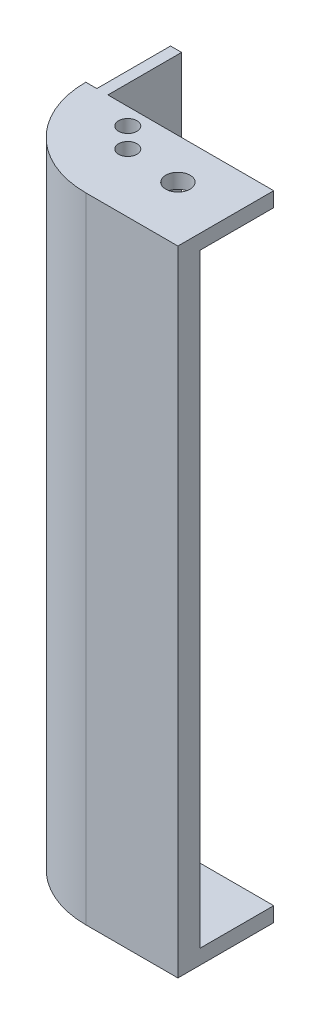
ISO-10303-21;
HEADER;
FILE_DESCRIPTION(('STEP AP214'),'2;1');
FILE_NAME('part.step','',(''),(''),'','','');
FILE_SCHEMA(('AUTOMOTIVE_DESIGN { 1 0 10303 214 1 1 1 1 }'));
ENDSEC;
DATA;
#1=APPLICATION_CONTEXT('core data for automotive mechanical design processes');
#2=APPLICATION_PROTOCOL_DEFINITION('international standard','automotive_design',2000,#1);
#3=PRODUCT_CONTEXT('',#1,'mechanical');
#4=PRODUCT('Part','Part','',(#3));
#5=PRODUCT_RELATED_PRODUCT_CATEGORY('part','',(#4));
#6=PRODUCT_DEFINITION_FORMATION('','',#4);
#7=PRODUCT_DEFINITION_CONTEXT('part definition',#1,'design');
#8=PRODUCT_DEFINITION('design','',#6,#7);
#9=PRODUCT_DEFINITION_SHAPE('','',#8);
#10=(LENGTH_UNIT() NAMED_UNIT(*) SI_UNIT(.MILLI.,.METRE.));
#11=(NAMED_UNIT(*) PLANE_ANGLE_UNIT() SI_UNIT($,.RADIAN.));
#12=(NAMED_UNIT(*) SI_UNIT($,.STERADIAN.) SOLID_ANGLE_UNIT());
#13=UNCERTAINTY_MEASURE_WITH_UNIT(LENGTH_MEASURE(1.E-05),#10,'distance_accuracy_value','');
#14=(GEOMETRIC_REPRESENTATION_CONTEXT(3) GLOBAL_UNCERTAINTY_ASSIGNED_CONTEXT((#13)) GLOBAL_UNIT_ASSIGNED_CONTEXT((#10,
#11,#12)) REPRESENTATION_CONTEXT('',''));
#15=CARTESIAN_POINT('',(0.,0.,0.));
#16=DIRECTION('',(0.,0.,1.));
#17=DIRECTION('',(1.,0.,0.));
#18=AXIS2_PLACEMENT_3D('',#15,#16,#17);
#19=CARTESIAN_POINT('',(0.,86.,2.49999999999996));
#20=DIRECTION('',(0.,0.,1.));
#21=DIRECTION('',(1.,0.,0.));
#22=AXIS2_PLACEMENT_3D('',#19,#20,#21);
#23=PLANE('',#22);
#24=DIRECTION('',(0.,1.,0.));
#25=VECTOR('',#24,1.);
#26=CARTESIAN_POINT('',(0.,86.,2.49999999999996));
#27=LINE('',#26,#25);
#28=CARTESIAN_POINT('',(0.,2.,2.5));
#29=VERTEX_POINT('',#28);
#30=CARTESIAN_POINT('',(0.,84.,2.49999999999996));
#31=VERTEX_POINT('',#30);
#32=EDGE_CURVE('E201',#29,#31,#27,.T.);
#33=ORIENTED_EDGE('',*,*,#32,.F.);
#34=DIRECTION('',(-1.,0.,0.));
#35=VECTOR('',#34,1.);
#36=CARTESIAN_POINT('',(10.1980390271856,2.,2.49999999999991));
#37=LINE('',#36,#35);
#38=CARTESIAN_POINT('',(-12.5,2.,2.5));
#39=VERTEX_POINT('',#38);
#40=EDGE_CURVE('E181',#29,#39,#37,.T.);
#41=ORIENTED_EDGE('',*,*,#40,.T.);
#42=DIRECTION('',(0.,1.,0.));
#43=VECTOR('',#42,1.);
#44=CARTESIAN_POINT('',(-12.5,2.,2.5));
#45=LINE('',#44,#43);
#46=CARTESIAN_POINT('',(-12.5,84.,2.5));
#47=VERTEX_POINT('',#46);
#48=EDGE_CURVE('E12',#39,#47,#45,.T.);
#49=ORIENTED_EDGE('',*,*,#48,.T.);
#50=DIRECTION('',(-1.,0.,0.));
#51=VECTOR('',#50,1.);
#52=CARTESIAN_POINT('',(10.1980390271856,84.,2.49999999999991));
#53=LINE('',#52,#51);
#54=EDGE_CURVE('E92',#31,#47,#53,.T.);
#55=ORIENTED_EDGE('',*,*,#54,.F.);
#56=EDGE_LOOP('',(#33,#41,#49,#55));
#57=FACE_BOUND('',#56,.T.);
#58=ADVANCED_FACE('F77',(#57),#23,.F.);
#59=CARTESIAN_POINT('',(-12.5,104.38477631085,-7.5));
#60=DIRECTION('',(0.,-1.,0.));
#61=DIRECTION('',(0.,0.,-1.));
#62=AXIS2_PLACEMENT_3D('',#59,#60,#61);
#63=CYLINDRICAL_SURFACE('',#62,10.);
#64=CARTESIAN_POINT('',(-12.5,2.,-7.5));
#65=DIRECTION('',(0.,1.,0.));
#66=DIRECTION('',(0.,0.,1.));
#67=AXIS2_PLACEMENT_3D('',#64,#65,#66);
#68=CIRCLE('',#67,10.);
#69=CARTESIAN_POINT('',(-22.5,2.,-7.5));
#70=VERTEX_POINT('',#69);
#71=EDGE_CURVE('E100',#70,#39,#68,.T.);
#72=ORIENTED_EDGE('',*,*,#71,.F.);
#73=DIRECTION('',(0.,-1.,0.));
#74=VECTOR('',#73,1.);
#75=CARTESIAN_POINT('',(-22.5,104.38477631085,-7.5));
#76=LINE('',#75,#74);
#77=CARTESIAN_POINT('',(-22.5,84.,-7.5));
#78=VERTEX_POINT('',#77);
#79=EDGE_CURVE('E286',#78,#70,#76,.T.);
#80=ORIENTED_EDGE('',*,*,#79,.F.);
#81=CARTESIAN_POINT('',(-12.5,84.,-7.5));
#82=DIRECTION('',(0.,1.,0.));
#83=DIRECTION('',(0.,0.,1.));
#84=AXIS2_PLACEMENT_3D('',#81,#82,#83);
#85=CIRCLE('',#84,10.);
#86=EDGE_CURVE('E243',#78,#47,#85,.T.);
#87=ORIENTED_EDGE('',*,*,#86,.T.);
#88=ORIENTED_EDGE('',*,*,#48,.F.);
#89=EDGE_LOOP('',(#72,#80,#87,#88));
#90=FACE_BOUND('',#89,.T.);
#91=ADVANCED_FACE('F340',(#90),#63,.F.);
#92=CARTESIAN_POINT('',(0.,0.,0.));
#93=DIRECTION('',(0.,1.,0.));
#94=DIRECTION('',(0.,0.,1.));
#95=AXIS2_PLACEMENT_3D('',#92,#93,#94);
#96=PLANE('',#95);
#97=CARTESIAN_POINT('',(-7.50000000000003,0.,-2.00000000000005));
#98=DIRECTION('',(0.,1.,0.));
#99=DIRECTION('',(0.,0.,1.));
#100=AXIS2_PLACEMENT_3D('',#97,#98,#99);
#101=CIRCLE('',#100,1.65);
#102=CARTESIAN_POINT('',(-7.50000000000003,0.,-0.35000000000005));
#103=VERTEX_POINT('',#102);
#104=EDGE_CURVE('E191',#103,#103,#101,.T.);
#105=ORIENTED_EDGE('',*,*,#104,.T.);
#106=EDGE_LOOP('',(#105));
#107=FACE_BOUND('',#106,.T.);
#108=DIRECTION('',(-1.,0.,0.));
#109=VECTOR('',#108,1.);
#110=CARTESIAN_POINT('',(-12.5,0.,-7.5));
#111=LINE('',#110,#109);
#112=CARTESIAN_POINT('',(0.,0.,-7.50000000000005));
#113=VERTEX_POINT('',#112);
#114=CARTESIAN_POINT('',(-22.5,0.,-7.5));
#115=VERTEX_POINT('',#114);
#116=EDGE_CURVE('E228',#113,#115,#111,.T.);
#117=ORIENTED_EDGE('',*,*,#116,.F.);
#118=DIRECTION('',(0.,0.,-1.));
#119=VECTOR('',#118,1.);
#120=CARTESIAN_POINT('',(0.,0.,5.49999999999995));
#121=LINE('',#120,#119);
#122=CARTESIAN_POINT('',(0.,0.,5.49999999999995));
#123=VERTEX_POINT('',#122);
#124=EDGE_CURVE('E190',#123,#113,#121,.T.);
#125=ORIENTED_EDGE('',*,*,#124,.F.);
#126=DIRECTION('',(-1.,0.,0.));
#127=VECTOR('',#126,1.);
#128=CARTESIAN_POINT('',(0.,0.,5.49999999999995));
#129=LINE('',#128,#127);
#130=CARTESIAN_POINT('',(-12.5,0.,5.5));
#131=VERTEX_POINT('',#130);
#132=EDGE_CURVE('E214',#123,#131,#129,.T.);
#133=ORIENTED_EDGE('',*,*,#132,.T.);
#134=CARTESIAN_POINT('',(-12.5,0.,-7.5));
#135=DIRECTION('',(0.,1.,0.));
#136=DIRECTION('',(0.,0.,1.));
#137=AXIS2_PLACEMENT_3D('',#134,#135,#136);
#138=CIRCLE('',#137,13.);
#139=CARTESIAN_POINT('',(-25.5,0.,-7.5));
#140=VERTEX_POINT('',#139);
#141=EDGE_CURVE('E273',#131,#140,#138,.F.);
#142=ORIENTED_EDGE('',*,*,#141,.T.);
#143=DIRECTION('',(1.,0.,0.));
#144=VECTOR('',#143,1.);
#145=CARTESIAN_POINT('',(-22.5,0.,-7.5));
#146=LINE('',#145,#144);
#147=CARTESIAN_POINT('',(-24.,0.,-7.5));
#148=VERTEX_POINT('',#147);
#149=EDGE_CURVE('E280',#140,#148,#146,.T.);
#150=ORIENTED_EDGE('',*,*,#149,.T.);
#151=DIRECTION('',(0.,0.,1.));
#152=VECTOR('',#151,1.);
#153=CARTESIAN_POINT('',(-24.,0.,-17.5));
#154=LINE('',#153,#152);
#155=CARTESIAN_POINT('',(-24.,0.,-17.5));
#156=VERTEX_POINT('',#155);
#157=EDGE_CURVE('E266',#156,#148,#154,.T.);
#158=ORIENTED_EDGE('',*,*,#157,.F.);
#159=DIRECTION('',(-1.,0.,0.));
#160=VECTOR('',#159,1.);
#161=CARTESIAN_POINT('',(-22.5,0.,-17.5));
#162=LINE('',#161,#160);
#163=CARTESIAN_POINT('',(-22.5,0.,-17.5));
#164=VERTEX_POINT('',#163);
#165=EDGE_CURVE('E253',#164,#156,#162,.T.);
#166=ORIENTED_EDGE('',*,*,#165,.F.);
#167=DIRECTION('',(0.,0.,1.));
#168=VECTOR('',#167,1.);
#169=CARTESIAN_POINT('',(-22.5,0.,-17.5));
#170=LINE('',#169,#168);
#171=EDGE_CURVE('E275',#164,#115,#170,.T.);
#172=ORIENTED_EDGE('',*,*,#171,.T.);
#173=EDGE_LOOP('',(#117,#125,#133,#142,#150,#158,#166,#172));
#174=FACE_BOUND('',#173,.T.);
#175=CARTESIAN_POINT('',(-14.8,0.,-2.5));
#176=DIRECTION('',(0.,1.,0.));
#177=DIRECTION('',(0.,0.,1.));
#178=AXIS2_PLACEMENT_3D('',#175,#176,#177);
#179=CIRCLE('',#178,1.25);
#180=CARTESIAN_POINT('',(-14.8,0.,-1.25));
#181=VERTEX_POINT('',#180);
#182=EDGE_CURVE('E224',#181,#181,#179,.F.);
#183=ORIENTED_EDGE('',*,*,#182,.F.);
#184=EDGE_LOOP('',(#183));
#185=FACE_BOUND('',#184,.T.);
#186=CARTESIAN_POINT('',(-17.5,0.,-5.2));
#187=DIRECTION('',(0.,1.,0.));
#188=DIRECTION('',(0.,0.,1.));
#189=AXIS2_PLACEMENT_3D('',#186,#187,#188);
#190=CIRCLE('',#189,1.25);
#191=CARTESIAN_POINT('',(-17.5,0.,-3.95));
#192=VERTEX_POINT('',#191);
#193=EDGE_CURVE('E220',#192,#192,#190,.F.);
#194=ORIENTED_EDGE('',*,*,#193,.F.);
#195=EDGE_LOOP('',(#194));
#196=FACE_BOUND('',#195,.T.);
#197=ADVANCED_FACE('F76',(#107,#174,#185,#196),#96,.F.);
#198=CARTESIAN_POINT('',(0.,86.,0.));
#199=DIRECTION('',(0.,-1.,0.));
#200=DIRECTION('',(0.,0.,-1.));
#201=AXIS2_PLACEMENT_3D('',#198,#199,#200);
#202=PLANE('',#201);
#203=CARTESIAN_POINT('',(-7.50000000000003,86.,-2.00000000000005));
#204=DIRECTION('',(0.,1.,0.));
#205=DIRECTION('',(0.,0.,1.));
#206=AXIS2_PLACEMENT_3D('',#203,#204,#205);
#207=CIRCLE('',#206,1.65);
#208=CARTESIAN_POINT('',(-7.50000000000003,86.,-0.35000000000005));
#209=VERTEX_POINT('',#208);
#210=EDGE_CURVE('E561',#209,#209,#207,.T.);
#211=ORIENTED_EDGE('',*,*,#210,.F.);
#212=EDGE_LOOP('',(#211));
#213=FACE_BOUND('',#212,.T.);
#214=CARTESIAN_POINT('',(-14.8,86.,-2.5));
#215=DIRECTION('',(0.,-1.,0.));
#216=DIRECTION('',(0.,0.,-1.));
#217=AXIS2_PLACEMENT_3D('',#214,#215,#216);
#218=CIRCLE('',#217,1.25);
#219=CARTESIAN_POINT('',(-14.8,86.,-3.75));
#220=VERTEX_POINT('',#219);
#221=EDGE_CURVE('E237',#220,#220,#218,.T.);
#222=ORIENTED_EDGE('',*,*,#221,.T.);
#223=EDGE_LOOP('',(#222));
#224=FACE_BOUND('',#223,.T.);
#225=CARTESIAN_POINT('',(-17.5,86.,-5.2));
#226=DIRECTION('',(0.,-1.,0.));
#227=DIRECTION('',(0.,0.,-1.));
#228=AXIS2_PLACEMENT_3D('',#225,#226,#227);
#229=CIRCLE('',#228,1.25);
#230=CARTESIAN_POINT('',(-17.5,86.,-6.45));
#231=VERTEX_POINT('',#230);
#232=EDGE_CURVE('E234',#231,#231,#229,.T.);
#233=ORIENTED_EDGE('',*,*,#232,.T.);
#234=EDGE_LOOP('',(#233));
#235=FACE_BOUND('',#234,.T.);
#236=CARTESIAN_POINT('',(-12.5,86.,-7.5));
#237=DIRECTION('',(0.,-1.,0.));
#238=DIRECTION('',(0.,0.,-1.));
#239=AXIS2_PLACEMENT_3D('',#236,#237,#238);
#240=CIRCLE('',#239,13.);
#241=CARTESIAN_POINT('',(-12.5,86.,5.5));
#242=VERTEX_POINT('',#241);
#243=CARTESIAN_POINT('',(-25.5,86.,-7.5));
#244=VERTEX_POINT('',#243);
#245=EDGE_CURVE('E284',#242,#244,#240,.T.);
#246=ORIENTED_EDGE('',*,*,#245,.F.);
#247=DIRECTION('',(-1.,0.,0.));
#248=VECTOR('',#247,1.);
#249=CARTESIAN_POINT('',(0.,86.,5.49999999999995));
#250=LINE('',#249,#248);
#251=CARTESIAN_POINT('',(0.,86.,5.49999999999995));
#252=VERTEX_POINT('',#251);
#253=EDGE_CURVE('E206',#252,#242,#250,.T.);
#254=ORIENTED_EDGE('',*,*,#253,.F.);
#255=DIRECTION('',(0.,0.,1.));
#256=VECTOR('',#255,1.);
#257=CARTESIAN_POINT('',(0.,86.,5.49999999999995));
#258=LINE('',#257,#256);
#259=CARTESIAN_POINT('',(0.,86.,-7.50000000000005));
#260=VERTEX_POINT('',#259);
#261=EDGE_CURVE('E207',#260,#252,#258,.T.);
#262=ORIENTED_EDGE('',*,*,#261,.F.);
#263=DIRECTION('',(-1.,0.,0.));
#264=VECTOR('',#263,1.);
#265=CARTESIAN_POINT('',(-12.5,86.,-7.5));
#266=LINE('',#265,#264);
#267=CARTESIAN_POINT('',(-22.5,86.,-7.5));
#268=VERTEX_POINT('',#267);
#269=EDGE_CURVE('E245',#260,#268,#266,.T.);
#270=ORIENTED_EDGE('',*,*,#269,.T.);
#271=DIRECTION('',(0.,0.,1.));
#272=VECTOR('',#271,1.);
#273=CARTESIAN_POINT('',(-22.5,86.,-17.5));
#274=LINE('',#273,#272);
#275=CARTESIAN_POINT('',(-22.5,86.,-17.5));
#276=VERTEX_POINT('',#275);
#277=EDGE_CURVE('E262',#276,#268,#274,.T.);
#278=ORIENTED_EDGE('',*,*,#277,.F.);
#279=DIRECTION('',(1.,0.,0.));
#280=VECTOR('',#279,1.);
#281=CARTESIAN_POINT('',(-22.5,86.,-17.5));
#282=LINE('',#281,#280);
#283=CARTESIAN_POINT('',(-24.,86.,-17.5));
#284=VERTEX_POINT('',#283);
#285=EDGE_CURVE('E258',#284,#276,#282,.T.);
#286=ORIENTED_EDGE('',*,*,#285,.F.);
#287=DIRECTION('',(0.,0.,1.));
#288=VECTOR('',#287,1.);
#289=CARTESIAN_POINT('',(-24.,86.,-17.5));
#290=LINE('',#289,#288);
#291=CARTESIAN_POINT('',(-24.,86.,-7.5));
#292=VERTEX_POINT('',#291);
#293=EDGE_CURVE('E267',#284,#292,#290,.T.);
#294=ORIENTED_EDGE('',*,*,#293,.T.);
#295=DIRECTION('',(1.,0.,0.));
#296=VECTOR('',#295,1.);
#297=CARTESIAN_POINT('',(-22.5,86.,-7.5));
#298=LINE('',#297,#296);
#299=EDGE_CURVE('E283',#244,#292,#298,.T.);
#300=ORIENTED_EDGE('',*,*,#299,.F.);
#301=EDGE_LOOP('',(#246,#254,#262,#270,#278,#286,#294,#300));
#302=FACE_BOUND('',#301,.T.);
#303=ADVANCED_FACE('F303',(#213,#224,#235,#302),#202,.F.);
#304=CARTESIAN_POINT('',(-22.5,104.38477631085,-7.5));
#305=DIRECTION('',(0.,0.,1.));
#306=DIRECTION('',(1.,0.,0.));
#307=AXIS2_PLACEMENT_3D('',#304,#305,#306);
#308=PLANE('',#307);
#309=DIRECTION('',(0.,1.,0.));
#310=VECTOR('',#309,1.);
#311=CARTESIAN_POINT('',(-24.,86.,-7.5));
#312=LINE('',#311,#310);
#313=EDGE_CURVE('E248',#148,#292,#312,.T.);
#314=ORIENTED_EDGE('',*,*,#313,.F.);
#315=ORIENTED_EDGE('',*,*,#149,.F.);
#316=DIRECTION('',(0.,-1.,0.));
#317=VECTOR('',#316,1.);
#318=CARTESIAN_POINT('',(-25.5,104.38477631085,-7.5));
#319=LINE('',#318,#317);
#320=EDGE_CURVE('E282',#244,#140,#319,.T.);
#321=ORIENTED_EDGE('',*,*,#320,.F.);
#322=ORIENTED_EDGE('',*,*,#299,.T.);
#323=EDGE_LOOP('',(#314,#315,#321,#322));
#324=FACE_BOUND('',#323,.T.);
#325=ADVANCED_FACE('F307',(#324),#308,.F.);
#326=CARTESIAN_POINT('',(-12.5,104.38477631085,-7.5));
#327=DIRECTION('',(0.,-1.,0.));
#328=DIRECTION('',(0.,0.,-1.));
#329=AXIS2_PLACEMENT_3D('',#326,#327,#328);
#330=CYLINDRICAL_SURFACE('',#329,13.);
#331=DIRECTION('',(0.,1.,0.));
#332=VECTOR('',#331,1.);
#333=CARTESIAN_POINT('',(-12.5,0.,5.5));
#334=LINE('',#333,#332);
#335=EDGE_CURVE('E82',#131,#242,#334,.T.);
#336=ORIENTED_EDGE('',*,*,#335,.T.);
#337=ORIENTED_EDGE('',*,*,#245,.T.);
#338=ORIENTED_EDGE('',*,*,#320,.T.);
#339=ORIENTED_EDGE('',*,*,#141,.F.);
#340=EDGE_LOOP('',(#336,#337,#338,#339));
#341=FACE_BOUND('',#340,.T.);
#342=ADVANCED_FACE('F294',(#341),#330,.T.);
#343=CARTESIAN_POINT('',(-22.5,86.,-17.5));
#344=DIRECTION('',(-1.,0.,0.));
#345=DIRECTION('',(0.,0.,1.));
#346=AXIS2_PLACEMENT_3D('',#343,#344,#345);
#347=PLANE('',#346);
#348=EDGE_CURVE('E287',#268,#78,#76,.T.);
#349=ORIENTED_EDGE('',*,*,#348,.T.);
#350=ORIENTED_EDGE('',*,*,#79,.T.);
#351=DIRECTION('',(0.,-1.,0.));
#352=VECTOR('',#351,1.);
#353=CARTESIAN_POINT('',(-22.5,2.,-7.5));
#354=LINE('',#353,#352);
#355=EDGE_CURVE('E174',#70,#115,#354,.T.);
#356=ORIENTED_EDGE('',*,*,#355,.T.);
#357=ORIENTED_EDGE('',*,*,#171,.F.);
#358=DIRECTION('',(0.,-1.,0.));
#359=VECTOR('',#358,1.);
#360=CARTESIAN_POINT('',(-22.5,86.,-17.5));
#361=LINE('',#360,#359);
#362=EDGE_CURVE('E255',#276,#164,#361,.T.);
#363=ORIENTED_EDGE('',*,*,#362,.F.);
#364=ORIENTED_EDGE('',*,*,#277,.T.);
#365=EDGE_LOOP('',(#349,#350,#356,#357,#363,#364));
#366=FACE_BOUND('',#365,.T.);
#367=ADVANCED_FACE('F318',(#366),#347,.F.);
#368=CARTESIAN_POINT('',(-24.,86.,-17.5));
#369=DIRECTION('',(1.,0.,0.));
#370=DIRECTION('',(0.,1.,0.));
#371=AXIS2_PLACEMENT_3D('',#368,#369,#370);
#372=PLANE('',#371);
#373=ORIENTED_EDGE('',*,*,#313,.T.);
#374=ORIENTED_EDGE('',*,*,#293,.F.);
#375=DIRECTION('',(0.,1.,0.));
#376=VECTOR('',#375,1.);
#377=CARTESIAN_POINT('',(-24.,86.,-17.5));
#378=LINE('',#377,#376);
#379=EDGE_CURVE('E256',#156,#284,#378,.T.);
#380=ORIENTED_EDGE('',*,*,#379,.F.);
#381=ORIENTED_EDGE('',*,*,#157,.T.);
#382=EDGE_LOOP('',(#373,#374,#380,#381));
#383=FACE_BOUND('',#382,.T.);
#384=ADVANCED_FACE('F327',(#383),#372,.F.);
#385=CARTESIAN_POINT('',(0.,0.,-17.5));
#386=DIRECTION('',(0.,0.,-1.));
#387=DIRECTION('',(-1.,0.,0.));
#388=AXIS2_PLACEMENT_3D('',#385,#386,#387);
#389=PLANE('',#388);
#390=ORIENTED_EDGE('',*,*,#362,.T.);
#391=ORIENTED_EDGE('',*,*,#165,.T.);
#392=ORIENTED_EDGE('',*,*,#379,.T.);
#393=ORIENTED_EDGE('',*,*,#285,.T.);
#394=EDGE_LOOP('',(#390,#391,#392,#393));
#395=FACE_BOUND('',#394,.T.);
#396=ADVANCED_FACE('F325',(#395),#389,.T.);
#397=CARTESIAN_POINT('',(-12.5,84.,-7.5));
#398=DIRECTION('',(0.,0.,-1.));
#399=DIRECTION('',(-1.,0.,0.));
#400=AXIS2_PLACEMENT_3D('',#397,#398,#399);
#401=PLANE('',#400);
#402=ORIENTED_EDGE('',*,*,#269,.F.);
#403=DIRECTION('',(0.,1.,0.));
#404=VECTOR('',#403,1.);
#405=CARTESIAN_POINT('',(0.,86.,-7.50000000000005));
#406=LINE('',#405,#404);
#407=CARTESIAN_POINT('',(0.,84.,-7.50000000000009));
#408=VERTEX_POINT('',#407);
#409=EDGE_CURVE('E198',#408,#260,#406,.T.);
#410=ORIENTED_EDGE('',*,*,#409,.F.);
#411=DIRECTION('',(-1.,0.,0.));
#412=VECTOR('',#411,1.);
#413=CARTESIAN_POINT('',(-12.5,84.,-7.5));
#414=LINE('',#413,#412);
#415=EDGE_CURVE('E246',#408,#78,#414,.T.);
#416=ORIENTED_EDGE('',*,*,#415,.T.);
#417=ORIENTED_EDGE('',*,*,#348,.F.);
#418=EDGE_LOOP('',(#402,#410,#416,#417));
#419=FACE_BOUND('',#418,.T.);
#420=ADVANCED_FACE('F317',(#419),#401,.T.);
#421=CARTESIAN_POINT('',(-12.5,84.,-7.5));
#422=DIRECTION('',(0.,1.,0.));
#423=DIRECTION('',(0.,0.,1.));
#424=AXIS2_PLACEMENT_3D('',#421,#422,#423);
#425=PLANE('',#424);
#426=CARTESIAN_POINT('',(-7.50000000000003,84.,-2.00000000000005));
#427=DIRECTION('',(0.,1.,0.));
#428=DIRECTION('',(0.,0.,1.));
#429=AXIS2_PLACEMENT_3D('',#426,#427,#428);
#430=CIRCLE('',#429,1.65);
#431=CARTESIAN_POINT('',(-7.50000000000003,84.,-0.35000000000005));
#432=VERTEX_POINT('',#431);
#433=EDGE_CURVE('E562',#432,#432,#430,.T.);
#434=ORIENTED_EDGE('',*,*,#433,.T.);
#435=EDGE_LOOP('',(#434));
#436=FACE_BOUND('',#435,.T.);
#437=CARTESIAN_POINT('',(-14.8,84.,-2.5));
#438=DIRECTION('',(0.,-1.,0.));
#439=DIRECTION('',(0.,0.,-1.));
#440=AXIS2_PLACEMENT_3D('',#437,#438,#439);
#441=CIRCLE('',#440,1.25);
#442=CARTESIAN_POINT('',(-14.8,84.,-3.75));
#443=VERTEX_POINT('',#442);
#444=EDGE_CURVE('E233',#443,#443,#441,.T.);
#445=ORIENTED_EDGE('',*,*,#444,.F.);
#446=EDGE_LOOP('',(#445));
#447=FACE_BOUND('',#446,.T.);
#448=CARTESIAN_POINT('',(-17.5,84.,-5.2));
#449=DIRECTION('',(0.,-1.,0.));
#450=DIRECTION('',(0.,0.,-1.));
#451=AXIS2_PLACEMENT_3D('',#448,#449,#450);
#452=CIRCLE('',#451,1.25);
#453=CARTESIAN_POINT('',(-17.5,84.,-6.45));
#454=VERTEX_POINT('',#453);
#455=EDGE_CURVE('E229',#454,#454,#452,.T.);
#456=ORIENTED_EDGE('',*,*,#455,.F.);
#457=EDGE_LOOP('',(#456));
#458=FACE_BOUND('',#457,.T.);
#459=ORIENTED_EDGE('',*,*,#86,.F.);
#460=ORIENTED_EDGE('',*,*,#415,.F.);
#461=DIRECTION('',(0.,0.,-1.));
#462=VECTOR('',#461,1.);
#463=CARTESIAN_POINT('',(0.,84.,-7.50000000000005));
#464=LINE('',#463,#462);
#465=EDGE_CURVE('E199',#31,#408,#464,.T.);
#466=ORIENTED_EDGE('',*,*,#465,.F.);
#467=ORIENTED_EDGE('',*,*,#54,.T.);
#468=EDGE_LOOP('',(#459,#460,#466,#467));
#469=FACE_BOUND('',#468,.T.);
#470=ADVANCED_FACE('F368',(#436,#447,#458,#469),#425,.F.);
#471=CARTESIAN_POINT('',(-17.5,87.,-5.2));
#472=DIRECTION('',(0.,-1.,0.));
#473=DIRECTION('',(0.,0.,-1.));
#474=AXIS2_PLACEMENT_3D('',#471,#472,#473);
#475=CYLINDRICAL_SURFACE('',#474,1.25);
#476=ORIENTED_EDGE('',*,*,#455,.T.);
#477=EDGE_LOOP('',(#476));
#478=FACE_BOUND('',#477,.T.);
#479=ORIENTED_EDGE('',*,*,#232,.F.);
#480=EDGE_LOOP('',(#479));
#481=FACE_BOUND('',#480,.T.);
#482=ADVANCED_FACE('F364',(#478,#481),#475,.F.);
#483=CARTESIAN_POINT('',(-14.8,87.,-2.5));
#484=DIRECTION('',(0.,-1.,0.));
#485=DIRECTION('',(0.,0.,-1.));
#486=AXIS2_PLACEMENT_3D('',#483,#484,#485);
#487=CYLINDRICAL_SURFACE('',#486,1.25);
#488=ORIENTED_EDGE('',*,*,#444,.T.);
#489=EDGE_LOOP('',(#488));
#490=FACE_BOUND('',#489,.T.);
#491=ORIENTED_EDGE('',*,*,#221,.F.);
#492=EDGE_LOOP('',(#491));
#493=FACE_BOUND('',#492,.T.);
#494=ADVANCED_FACE('F363',(#490,#493),#487,.F.);
#495=CARTESIAN_POINT('',(-12.5,2.,-7.5));
#496=DIRECTION('',(0.,0.,1.));
#497=DIRECTION('',(1.,0.,0.));
#498=AXIS2_PLACEMENT_3D('',#495,#496,#497);
#499=PLANE('',#498);
#500=ORIENTED_EDGE('',*,*,#116,.T.);
#501=ORIENTED_EDGE('',*,*,#355,.F.);
#502=DIRECTION('',(-1.,0.,0.));
#503=VECTOR('',#502,1.);
#504=CARTESIAN_POINT('',(-12.5,2.,-7.5));
#505=LINE('',#504,#503);
#506=CARTESIAN_POINT('',(0.,2.,-7.50000000000005));
#507=VERTEX_POINT('',#506);
#508=EDGE_CURVE('E169',#507,#70,#505,.T.);
#509=ORIENTED_EDGE('',*,*,#508,.F.);
#510=DIRECTION('',(0.,1.,0.));
#511=VECTOR('',#510,1.);
#512=CARTESIAN_POINT('',(0.,2.,-7.50000000000005));
#513=LINE('',#512,#511);
#514=EDGE_CURVE('E172',#113,#507,#513,.T.);
#515=ORIENTED_EDGE('',*,*,#514,.F.);
#516=EDGE_LOOP('',(#500,#501,#509,#515));
#517=FACE_BOUND('',#516,.T.);
#518=ADVANCED_FACE('F175',(#517),#499,.F.);
#519=CARTESIAN_POINT('',(-12.5,2.,-7.5));
#520=DIRECTION('',(0.,-1.,0.));
#521=DIRECTION('',(0.,0.,1.));
#522=AXIS2_PLACEMENT_3D('',#519,#520,#521);
#523=PLANE('',#522);
#524=CARTESIAN_POINT('',(-7.50000000000003,2.,-2.00000000000005));
#525=DIRECTION('',(0.,-1.,0.));
#526=DIRECTION('',(0.,0.,-1.));
#527=AXIS2_PLACEMENT_3D('',#524,#525,#526);
#528=CIRCLE('',#527,1.65);
#529=CARTESIAN_POINT('',(-7.50000000000003,2.,-3.65000000000005));
#530=VERTEX_POINT('',#529);
#531=EDGE_CURVE('E78',#530,#530,#528,.T.);
#532=ORIENTED_EDGE('',*,*,#531,.T.);
#533=EDGE_LOOP('',(#532));
#534=FACE_BOUND('',#533,.T.);
#535=CARTESIAN_POINT('',(-14.8,2.,-2.5));
#536=DIRECTION('',(0.,-1.,0.));
#537=DIRECTION('',(0.,0.,-1.));
#538=AXIS2_PLACEMENT_3D('',#535,#536,#537);
#539=CIRCLE('',#538,1.25);
#540=CARTESIAN_POINT('',(-14.8,2.,-3.75));
#541=VERTEX_POINT('',#540);
#542=EDGE_CURVE('E212',#541,#541,#539,.T.);
#543=ORIENTED_EDGE('',*,*,#542,.T.);
#544=EDGE_LOOP('',(#543));
#545=FACE_BOUND('',#544,.T.);
#546=CARTESIAN_POINT('',(-17.5,2.,-5.2));
#547=DIRECTION('',(0.,-1.,0.));
#548=DIRECTION('',(0.,0.,-1.));
#549=AXIS2_PLACEMENT_3D('',#546,#547,#548);
#550=CIRCLE('',#549,1.25);
#551=CARTESIAN_POINT('',(-17.5,2.,-6.45));
#552=VERTEX_POINT('',#551);
#553=EDGE_CURVE('E213',#552,#552,#550,.T.);
#554=ORIENTED_EDGE('',*,*,#553,.T.);
#555=EDGE_LOOP('',(#554));
#556=FACE_BOUND('',#555,.T.);
#557=ORIENTED_EDGE('',*,*,#71,.T.);
#558=ORIENTED_EDGE('',*,*,#40,.F.);
#559=DIRECTION('',(0.,0.,1.));
#560=VECTOR('',#559,1.);
#561=CARTESIAN_POINT('',(0.,2.,2.49999999999995));
#562=LINE('',#561,#560);
#563=EDGE_CURVE('E177',#507,#29,#562,.T.);
#564=ORIENTED_EDGE('',*,*,#563,.F.);
#565=ORIENTED_EDGE('',*,*,#508,.T.);
#566=EDGE_LOOP('',(#557,#558,#564,#565));
#567=FACE_BOUND('',#566,.T.);
#568=ADVANCED_FACE('F179',(#534,#545,#556,#567),#523,.F.);
#569=CARTESIAN_POINT('',(-17.5,-0.999999999999998,-5.2));
#570=DIRECTION('',(0.,1.,0.));
#571=DIRECTION('',(0.,0.,1.));
#572=AXIS2_PLACEMENT_3D('',#569,#570,#571);
#573=CYLINDRICAL_SURFACE('',#572,1.25);
#574=ORIENTED_EDGE('',*,*,#553,.F.);
#575=EDGE_LOOP('',(#574));
#576=FACE_BOUND('',#575,.T.);
#577=ORIENTED_EDGE('',*,*,#193,.T.);
#578=EDGE_LOOP('',(#577));
#579=FACE_BOUND('',#578,.T.);
#580=ADVANCED_FACE('F352',(#576,#579),#573,.F.);
#581=CARTESIAN_POINT('',(-14.8,-0.999999999999998,-2.5));
#582=DIRECTION('',(0.,1.,0.));
#583=DIRECTION('',(0.,0.,1.));
#584=AXIS2_PLACEMENT_3D('',#581,#582,#583);
#585=CYLINDRICAL_SURFACE('',#584,1.25);
#586=ORIENTED_EDGE('',*,*,#542,.F.);
#587=EDGE_LOOP('',(#586));
#588=FACE_BOUND('',#587,.T.);
#589=ORIENTED_EDGE('',*,*,#182,.T.);
#590=EDGE_LOOP('',(#589));
#591=FACE_BOUND('',#590,.T.);
#592=ADVANCED_FACE('F350',(#588,#591),#585,.F.);
#593=CARTESIAN_POINT('',(0.,86.,5.49999999999995));
#594=DIRECTION('',(0.,0.,-1.));
#595=DIRECTION('',(-1.,0.,0.));
#596=AXIS2_PLACEMENT_3D('',#593,#594,#595);
#597=PLANE('',#596);
#598=ORIENTED_EDGE('',*,*,#335,.F.);
#599=ORIENTED_EDGE('',*,*,#132,.F.);
#600=DIRECTION('',(0.,-1.,0.));
#601=VECTOR('',#600,1.);
#602=CARTESIAN_POINT('',(0.,86.,5.49999999999995));
#603=LINE('',#602,#601);
#604=EDGE_CURVE('E189',#252,#123,#603,.T.);
#605=ORIENTED_EDGE('',*,*,#604,.F.);
#606=ORIENTED_EDGE('',*,*,#253,.T.);
#607=EDGE_LOOP('',(#598,#599,#605,#606));
#608=FACE_BOUND('',#607,.T.);
#609=ADVANCED_FACE('F297',(#608),#597,.F.);
#610=CARTESIAN_POINT('',(0.,0.,0.));
#611=DIRECTION('',(1.,0.,0.));
#612=DIRECTION('',(0.,0.,-1.));
#613=AXIS2_PLACEMENT_3D('',#610,#611,#612);
#614=PLANE('',#613);
#615=ORIENTED_EDGE('',*,*,#604,.T.);
#616=ORIENTED_EDGE('',*,*,#124,.T.);
#617=ORIENTED_EDGE('',*,*,#514,.T.);
#618=ORIENTED_EDGE('',*,*,#563,.T.);
#619=ORIENTED_EDGE('',*,*,#32,.T.);
#620=ORIENTED_EDGE('',*,*,#465,.T.);
#621=ORIENTED_EDGE('',*,*,#409,.T.);
#622=ORIENTED_EDGE('',*,*,#261,.T.);
#623=EDGE_LOOP('',(#615,#616,#617,#618,#619,#620,#621,#622));
#624=FACE_BOUND('',#623,.T.);
#625=ADVANCED_FACE('F187',(#624),#614,.T.);
#626=CARTESIAN_POINT('',(-7.50000000000003,-14.,-2.00000000000005));
#627=DIRECTION('',(0.,1.,0.));
#628=DIRECTION('',(0.,0.,1.));
#629=AXIS2_PLACEMENT_3D('',#626,#627,#628);
#630=CYLINDRICAL_SURFACE('',#629,1.65);
#631=ORIENTED_EDGE('',*,*,#531,.F.);
#632=EDGE_LOOP('',(#631));
#633=FACE_BOUND('',#632,.T.);
#634=ORIENTED_EDGE('',*,*,#104,.F.);
#635=EDGE_LOOP('',(#634));
#636=FACE_BOUND('',#635,.T.);
#637=ADVANCED_FACE('F395',(#633,#636),#630,.F.);
#638=ORIENTED_EDGE('',*,*,#210,.T.);
#639=EDGE_LOOP('',(#638));
#640=FACE_BOUND('',#639,.T.);
#641=ORIENTED_EDGE('',*,*,#433,.F.);
#642=EDGE_LOOP('',(#641));
#643=FACE_BOUND('',#642,.T.);
#644=ADVANCED_FACE('F422',(#640,#643),#630,.F.);
#645=CLOSED_SHELL('',(#58,#91,#197,#303,#325,#342,#367,#384,#396,#420,#470,#482,#494,#518,#568,
#580,#592,#609,#625,#637,#644));
#646=MANIFOLD_SOLID_BREP('B2',#645);
#647=ADVANCED_BREP_SHAPE_REPRESENTATION('',(#18,#646),#14);
#648=SHAPE_DEFINITION_REPRESENTATION(#9,#647);
ENDSEC;
END-ISO-10303-21;
